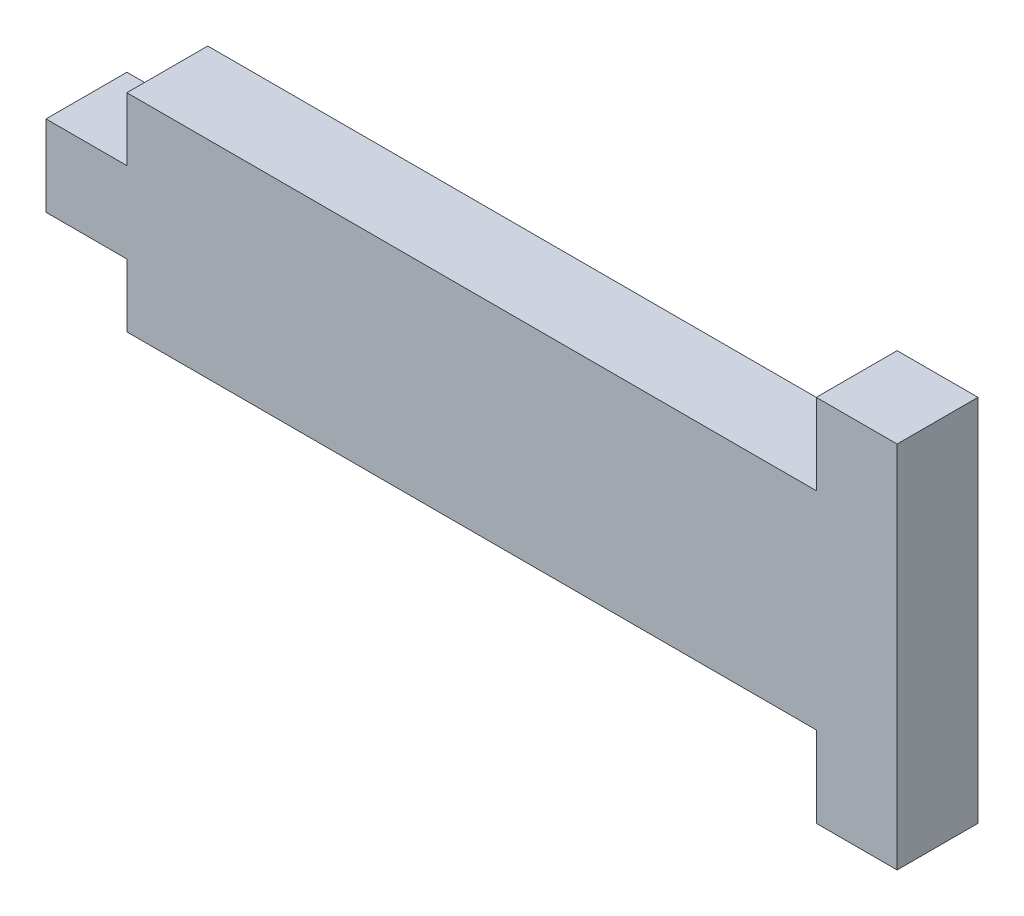
ISO-10303-21;
HEADER;
FILE_DESCRIPTION(('STEP AP214'),'2;1');
FILE_NAME('part.step','',(''),(''),'','','');
FILE_SCHEMA(('AUTOMOTIVE_DESIGN { 1 0 10303 214 1 1 1 1 }'));
ENDSEC;
DATA;
#1=APPLICATION_CONTEXT('core data for automotive mechanical design processes');
#2=APPLICATION_PROTOCOL_DEFINITION('international standard','automotive_design',2000,#1);
#3=PRODUCT_CONTEXT('',#1,'mechanical');
#4=PRODUCT('Part','Part','',(#3));
#5=PRODUCT_RELATED_PRODUCT_CATEGORY('part','',(#4));
#6=PRODUCT_DEFINITION_FORMATION('','',#4);
#7=PRODUCT_DEFINITION_CONTEXT('part definition',#1,'design');
#8=PRODUCT_DEFINITION('design','',#6,#7);
#9=PRODUCT_DEFINITION_SHAPE('','',#8);
#10=(LENGTH_UNIT() NAMED_UNIT(*) SI_UNIT(.MILLI.,.METRE.));
#11=(NAMED_UNIT(*) PLANE_ANGLE_UNIT() SI_UNIT($,.RADIAN.));
#12=(NAMED_UNIT(*) SI_UNIT($,.STERADIAN.) SOLID_ANGLE_UNIT());
#13=UNCERTAINTY_MEASURE_WITH_UNIT(LENGTH_MEASURE(1.E-05),#10,'distance_accuracy_value','');
#14=(GEOMETRIC_REPRESENTATION_CONTEXT(3) GLOBAL_UNCERTAINTY_ASSIGNED_CONTEXT((#13)) GLOBAL_UNIT_ASSIGNED_CONTEXT((#10,
#11,#12)) REPRESENTATION_CONTEXT('',''));
#15=CARTESIAN_POINT('',(0.,0.,0.));
#16=DIRECTION('',(0.,0.,1.));
#17=DIRECTION('',(1.,0.,0.));
#18=AXIS2_PLACEMENT_3D('',#15,#16,#17);
#19=CARTESIAN_POINT('',(-20.3,0.,4.7625));
#20=DIRECTION('',(1.,0.,0.));
#21=DIRECTION('',(0.,0.,-1.));
#22=AXIS2_PLACEMENT_3D('',#19,#20,#21);
#23=PLANE('',#22);
#24=DIRECTION('',(0.,-1.,0.));
#25=VECTOR('',#24,1.);
#26=CARTESIAN_POINT('',(-20.3,0.,0.));
#27=LINE('',#26,#25);
#28=CARTESIAN_POINT('',(-20.3,3.71875000000001,0.));
#29=VERTEX_POINT('',#28);
#30=CARTESIAN_POINT('',(-20.3,0.,0.));
#31=VERTEX_POINT('',#30);
#32=EDGE_CURVE('E159',#29,#31,#27,.T.);
#33=ORIENTED_EDGE('',*,*,#32,.T.);
#34=DIRECTION('',(0.,0.,-1.));
#35=VECTOR('',#34,1.);
#36=CARTESIAN_POINT('',(-20.3,0.,4.7625));
#37=LINE('',#36,#35);
#38=CARTESIAN_POINT('',(-20.3,0.,4.7625));
#39=VERTEX_POINT('',#38);
#40=EDGE_CURVE('E94',#39,#31,#37,.T.);
#41=ORIENTED_EDGE('',*,*,#40,.F.);
#42=DIRECTION('',(0.,-1.,0.));
#43=VECTOR('',#42,1.);
#44=CARTESIAN_POINT('',(-20.3,0.,4.7625));
#45=LINE('',#44,#43);
#46=CARTESIAN_POINT('',(-20.3,3.71875000000001,4.7625));
#47=VERTEX_POINT('',#46);
#48=EDGE_CURVE('E189',#47,#39,#45,.T.);
#49=ORIENTED_EDGE('',*,*,#48,.F.);
#50=DIRECTION('',(0.,0.,-1.));
#51=VECTOR('',#50,1.);
#52=CARTESIAN_POINT('',(-20.3,3.71875000000001,4.7625));
#53=LINE('',#52,#51);
#54=EDGE_CURVE('E13',#47,#29,#53,.T.);
#55=ORIENTED_EDGE('',*,*,#54,.T.);
#56=EDGE_LOOP('',(#33,#41,#49,#55));
#57=FACE_BOUND('',#56,.T.);
#58=ADVANCED_FACE('F84',(#57),#23,.F.);
#59=CARTESIAN_POINT('',(0.,0.,4.7625));
#60=DIRECTION('',(0.,1.,0.));
#61=DIRECTION('',(0.,0.,1.));
#62=AXIS2_PLACEMENT_3D('',#59,#60,#61);
#63=PLANE('',#62);
#64=DIRECTION('',(1.,0.,0.));
#65=VECTOR('',#64,1.);
#66=CARTESIAN_POINT('',(0.,0.,0.));
#67=LINE('',#66,#65);
#68=CARTESIAN_POINT('',(20.3,0.,1.8474805019153E-13));
#69=VERTEX_POINT('',#68);
#70=EDGE_CURVE('E231',#31,#69,#67,.T.);
#71=ORIENTED_EDGE('',*,*,#70,.T.);
#72=DIRECTION('',(0.,0.,-1.));
#73=VECTOR('',#72,1.);
#74=CARTESIAN_POINT('',(20.3,0.,4.76250000000018));
#75=LINE('',#74,#73);
#76=CARTESIAN_POINT('',(20.3,0.,4.76250000000018));
#77=VERTEX_POINT('',#76);
#78=EDGE_CURVE('E264',#77,#69,#75,.T.);
#79=ORIENTED_EDGE('',*,*,#78,.F.);
#80=DIRECTION('',(1.,0.,0.));
#81=VECTOR('',#80,1.);
#82=CARTESIAN_POINT('',(0.,0.,4.7625));
#83=LINE('',#82,#81);
#84=EDGE_CURVE('E193',#39,#77,#83,.T.);
#85=ORIENTED_EDGE('',*,*,#84,.F.);
#86=ORIENTED_EDGE('',*,*,#40,.T.);
#87=EDGE_LOOP('',(#71,#79,#85,#86));
#88=FACE_BOUND('',#87,.T.);
#89=ADVANCED_FACE('F290',(#88),#63,.F.);
#90=CARTESIAN_POINT('',(20.3,0.,4.76250000000031));
#91=DIRECTION('',(1.,0.,0.));
#92=DIRECTION('',(0.,1.,0.));
#93=AXIS2_PLACEMENT_3D('',#90,#91,#92);
#94=PLANE('',#93);
#95=DIRECTION('',(0.,-1.,0.));
#96=VECTOR('',#95,1.);
#97=CARTESIAN_POINT('',(20.3,0.,3.07046055247895E-13));
#98=LINE('',#97,#96);
#99=CARTESIAN_POINT('',(20.3,-4.76249999999999,3.07046055247895E-13));
#100=VERTEX_POINT('',#99);
#101=EDGE_CURVE('E233',#69,#100,#98,.T.);
#102=ORIENTED_EDGE('',*,*,#101,.T.);
#103=DIRECTION('',(0.,0.,-1.));
#104=VECTOR('',#103,1.);
#105=CARTESIAN_POINT('',(20.3,-4.76249999999999,4.76250000000031));
#106=LINE('',#105,#104);
#107=CARTESIAN_POINT('',(20.3,-4.76249999999999,4.76250000000031));
#108=VERTEX_POINT('',#107);
#109=EDGE_CURVE('E261',#108,#100,#106,.T.);
#110=ORIENTED_EDGE('',*,*,#109,.F.);
#111=DIRECTION('',(0.,-1.,0.));
#112=VECTOR('',#111,1.);
#113=CARTESIAN_POINT('',(20.3,0.,4.76250000000031));
#114=LINE('',#113,#112);
#115=EDGE_CURVE('E201',#77,#108,#114,.T.);
#116=ORIENTED_EDGE('',*,*,#115,.F.);
#117=ORIENTED_EDGE('',*,*,#78,.T.);
#118=EDGE_LOOP('',(#102,#110,#116,#117));
#119=FACE_BOUND('',#118,.T.);
#120=ADVANCED_FACE('F336',(#119),#94,.F.);
#121=CARTESIAN_POINT('',(0.,-4.7625,4.7625));
#122=DIRECTION('',(0.,1.,0.));
#123=DIRECTION('',(-1.,0.,0.));
#124=AXIS2_PLACEMENT_3D('',#121,#122,#123);
#125=PLANE('',#124);
#126=DIRECTION('',(1.,0.,0.));
#127=VECTOR('',#126,1.);
#128=CARTESIAN_POINT('',(0.,-4.7625,0.));
#129=LINE('',#128,#127);
#130=CARTESIAN_POINT('',(25.0625,-4.76249999999999,0.));
#131=VERTEX_POINT('',#130);
#132=EDGE_CURVE('E235',#100,#131,#129,.T.);
#133=ORIENTED_EDGE('',*,*,#132,.T.);
#134=DIRECTION('',(0.,0.,-1.));
#135=VECTOR('',#134,1.);
#136=CARTESIAN_POINT('',(25.0625,-4.76249999999999,4.7625));
#137=LINE('',#136,#135);
#138=CARTESIAN_POINT('',(25.0625,-4.76249999999999,4.7625));
#139=VERTEX_POINT('',#138);
#140=EDGE_CURVE('E258',#139,#131,#137,.T.);
#141=ORIENTED_EDGE('',*,*,#140,.F.);
#142=DIRECTION('',(1.,0.,0.));
#143=VECTOR('',#142,1.);
#144=CARTESIAN_POINT('',(0.,-4.7625,4.7625));
#145=LINE('',#144,#143);
#146=EDGE_CURVE('E206',#108,#139,#145,.T.);
#147=ORIENTED_EDGE('',*,*,#146,.F.);
#148=ORIENTED_EDGE('',*,*,#109,.T.);
#149=EDGE_LOOP('',(#133,#141,#147,#148));
#150=FACE_BOUND('',#149,.T.);
#151=ADVANCED_FACE('F339',(#150),#125,.F.);
#152=CARTESIAN_POINT('',(25.0625,0.,4.7625));
#153=DIRECTION('',(-1.,0.,0.));
#154=DIRECTION('',(0.,0.,1.));
#155=AXIS2_PLACEMENT_3D('',#152,#153,#154);
#156=PLANE('',#155);
#157=DIRECTION('',(0.,1.,0.));
#158=VECTOR('',#157,1.);
#159=CARTESIAN_POINT('',(25.0625,0.,0.));
#160=LINE('',#159,#158);
#161=CARTESIAN_POINT('',(25.0625,16.9625,0.));
#162=VERTEX_POINT('',#161);
#163=EDGE_CURVE('E237',#131,#162,#160,.T.);
#164=ORIENTED_EDGE('',*,*,#163,.T.);
#165=DIRECTION('',(0.,0.,-1.));
#166=VECTOR('',#165,1.);
#167=CARTESIAN_POINT('',(25.0625,16.9625,4.7625));
#168=LINE('',#167,#166);
#169=CARTESIAN_POINT('',(25.0625,16.9625,4.7625));
#170=VERTEX_POINT('',#169);
#171=EDGE_CURVE('E255',#170,#162,#168,.T.);
#172=ORIENTED_EDGE('',*,*,#171,.F.);
#173=DIRECTION('',(0.,1.,0.));
#174=VECTOR('',#173,1.);
#175=CARTESIAN_POINT('',(25.0625,0.,4.7625));
#176=LINE('',#175,#174);
#177=EDGE_CURVE('E213',#139,#170,#176,.T.);
#178=ORIENTED_EDGE('',*,*,#177,.F.);
#179=ORIENTED_EDGE('',*,*,#140,.T.);
#180=EDGE_LOOP('',(#164,#172,#178,#179));
#181=FACE_BOUND('',#180,.T.);
#182=ADVANCED_FACE('F343',(#181),#156,.F.);
#183=CARTESIAN_POINT('',(0.,16.9625,4.7625));
#184=DIRECTION('',(0.,-1.,0.));
#185=DIRECTION('',(1.,0.,0.));
#186=AXIS2_PLACEMENT_3D('',#183,#184,#185);
#187=PLANE('',#186);
#188=DIRECTION('',(-1.,0.,0.));
#189=VECTOR('',#188,1.);
#190=CARTESIAN_POINT('',(0.,16.9625,0.));
#191=LINE('',#190,#189);
#192=CARTESIAN_POINT('',(20.3,16.9625,1.07552855510562E-13));
#193=VERTEX_POINT('',#192);
#194=EDGE_CURVE('E239',#162,#193,#191,.T.);
#195=ORIENTED_EDGE('',*,*,#194,.T.);
#196=DIRECTION('',(0.,0.,-1.));
#197=VECTOR('',#196,1.);
#198=CARTESIAN_POINT('',(20.3,16.9625,4.76250000000011));
#199=LINE('',#198,#197);
#200=CARTESIAN_POINT('',(20.3,16.9625,4.76250000000011));
#201=VERTEX_POINT('',#200);
#202=EDGE_CURVE('E252',#201,#193,#199,.T.);
#203=ORIENTED_EDGE('',*,*,#202,.F.);
#204=DIRECTION('',(-1.,0.,0.));
#205=VECTOR('',#204,1.);
#206=CARTESIAN_POINT('',(0.,16.9625,4.7625));
#207=LINE('',#206,#205);
#208=EDGE_CURVE('E217',#170,#201,#207,.T.);
#209=ORIENTED_EDGE('',*,*,#208,.F.);
#210=ORIENTED_EDGE('',*,*,#171,.T.);
#211=EDGE_LOOP('',(#195,#203,#209,#210));
#212=FACE_BOUND('',#211,.T.);
#213=ADVANCED_FACE('F347',(#212),#187,.F.);
#214=CARTESIAN_POINT('',(20.3,0.,4.76250000000011));
#215=DIRECTION('',(1.,0.,0.));
#216=DIRECTION('',(0.,1.,0.));
#217=AXIS2_PLACEMENT_3D('',#214,#215,#216);
#218=PLANE('',#217);
#219=DIRECTION('',(0.,-1.,0.));
#220=VECTOR('',#219,1.);
#221=CARTESIAN_POINT('',(20.3,0.,1.07552855510562E-13));
#222=LINE('',#221,#220);
#223=CARTESIAN_POINT('',(20.3,12.1999999999999,0.));
#224=VERTEX_POINT('',#223);
#225=EDGE_CURVE('E241',#193,#224,#222,.T.);
#226=ORIENTED_EDGE('',*,*,#225,.T.);
#227=DIRECTION('',(0.,0.,-1.));
#228=VECTOR('',#227,1.);
#229=CARTESIAN_POINT('',(20.3,12.1999999999999,4.76250000000009));
#230=LINE('',#229,#228);
#231=CARTESIAN_POINT('',(20.3,12.1999999999999,4.76250000000009));
#232=VERTEX_POINT('',#231);
#233=EDGE_CURVE('E249',#232,#224,#230,.T.);
#234=ORIENTED_EDGE('',*,*,#233,.F.);
#235=DIRECTION('',(0.,-1.,0.));
#236=VECTOR('',#235,1.);
#237=CARTESIAN_POINT('',(20.3,0.,4.76250000000011));
#238=LINE('',#237,#236);
#239=EDGE_CURVE('E222',#201,#232,#238,.T.);
#240=ORIENTED_EDGE('',*,*,#239,.F.);
#241=ORIENTED_EDGE('',*,*,#202,.T.);
#242=EDGE_LOOP('',(#226,#234,#240,#241));
#243=FACE_BOUND('',#242,.T.);
#244=ADVANCED_FACE('F310',(#243),#218,.F.);
#245=CARTESIAN_POINT('',(0.,12.2,4.7625));
#246=DIRECTION('',(0.,-1.,0.));
#247=DIRECTION('',(0.,0.,-1.));
#248=AXIS2_PLACEMENT_3D('',#245,#246,#247);
#249=PLANE('',#248);
#250=DIRECTION('',(-1.,0.,0.));
#251=VECTOR('',#250,1.);
#252=CARTESIAN_POINT('',(0.,12.2,0.));
#253=LINE('',#252,#251);
#254=CARTESIAN_POINT('',(-20.3,12.2,0.));
#255=VERTEX_POINT('',#254);
#256=EDGE_CURVE('E243',#224,#255,#253,.T.);
#257=ORIENTED_EDGE('',*,*,#256,.T.);
#258=DIRECTION('',(0.,0.,-1.));
#259=VECTOR('',#258,1.);
#260=CARTESIAN_POINT('',(-20.3,12.2,4.7625));
#261=LINE('',#260,#259);
#262=CARTESIAN_POINT('',(-20.3,12.2,4.7625));
#263=VERTEX_POINT('',#262);
#264=EDGE_CURVE('E246',#263,#255,#261,.T.);
#265=ORIENTED_EDGE('',*,*,#264,.F.);
#266=DIRECTION('',(-1.,0.,0.));
#267=VECTOR('',#266,1.);
#268=CARTESIAN_POINT('',(0.,12.2,4.7625));
#269=LINE('',#268,#267);
#270=EDGE_CURVE('E226',#232,#263,#269,.T.);
#271=ORIENTED_EDGE('',*,*,#270,.F.);
#272=ORIENTED_EDGE('',*,*,#233,.T.);
#273=EDGE_LOOP('',(#257,#265,#271,#272));
#274=FACE_BOUND('',#273,.T.);
#275=ADVANCED_FACE('F314',(#274),#249,.F.);
#276=CARTESIAN_POINT('',(-20.3,8.48125000000001,0.));
#277=VERTEX_POINT('',#276);
#278=EDGE_CURVE('E194',#255,#277,#27,.T.);
#279=ORIENTED_EDGE('',*,*,#278,.T.);
#280=DIRECTION('',(0.,0.,-1.));
#281=VECTOR('',#280,1.);
#282=CARTESIAN_POINT('',(-20.3,8.48125000000001,4.7625));
#283=LINE('',#282,#281);
#284=CARTESIAN_POINT('',(-20.3,8.48125000000001,4.7625));
#285=VERTEX_POINT('',#284);
#286=EDGE_CURVE('E103',#285,#277,#283,.T.);
#287=ORIENTED_EDGE('',*,*,#286,.F.);
#288=EDGE_CURVE('E195',#263,#285,#45,.T.);
#289=ORIENTED_EDGE('',*,*,#288,.F.);
#290=ORIENTED_EDGE('',*,*,#264,.T.);
#291=EDGE_LOOP('',(#279,#287,#289,#290));
#292=FACE_BOUND('',#291,.T.);
#293=ADVANCED_FACE('F315',(#292),#23,.F.);
#294=CARTESIAN_POINT('',(0.,0.,0.));
#295=DIRECTION('',(0.,0.,1.));
#296=DIRECTION('',(1.,0.,0.));
#297=AXIS2_PLACEMENT_3D('',#294,#295,#296);
#298=PLANE('',#297);
#299=DIRECTION('',(1.,0.,0.));
#300=VECTOR('',#299,1.);
#301=CARTESIAN_POINT('',(-25.0625,8.48125,0.));
#302=LINE('',#301,#300);
#303=CARTESIAN_POINT('',(-25.0625,8.48125,0.));
#304=VERTEX_POINT('',#303);
#305=EDGE_CURVE('E165',#304,#277,#302,.T.);
#306=ORIENTED_EDGE('',*,*,#305,.T.);
#307=ORIENTED_EDGE('',*,*,#278,.F.);
#308=ORIENTED_EDGE('',*,*,#256,.F.);
#309=ORIENTED_EDGE('',*,*,#225,.F.);
#310=ORIENTED_EDGE('',*,*,#194,.F.);
#311=ORIENTED_EDGE('',*,*,#163,.F.);
#312=ORIENTED_EDGE('',*,*,#132,.F.);
#313=ORIENTED_EDGE('',*,*,#101,.F.);
#314=ORIENTED_EDGE('',*,*,#70,.F.);
#315=ORIENTED_EDGE('',*,*,#32,.F.);
#316=DIRECTION('',(1.,0.,0.));
#317=VECTOR('',#316,1.);
#318=CARTESIAN_POINT('',(-25.0625,3.71875,0.));
#319=LINE('',#318,#317);
#320=CARTESIAN_POINT('',(-25.0625,3.71875,0.));
#321=VERTEX_POINT('',#320);
#322=EDGE_CURVE('E168',#321,#29,#319,.T.);
#323=ORIENTED_EDGE('',*,*,#322,.F.);
#324=DIRECTION('',(0.,-1.,0.));
#325=VECTOR('',#324,1.);
#326=CARTESIAN_POINT('',(-25.0625,8.48125,0.));
#327=LINE('',#326,#325);
#328=EDGE_CURVE('E150',#304,#321,#327,.T.);
#329=ORIENTED_EDGE('',*,*,#328,.F.);
#330=EDGE_LOOP('',(#306,#307,#308,#309,#310,#311,#312,#313,#314,#315,#323,#329));
#331=FACE_BOUND('',#330,.T.);
#332=ADVANCED_FACE('F163',(#331),#298,.F.);
#333=CARTESIAN_POINT('',(0.,0.,4.7625));
#334=DIRECTION('',(0.,0.,1.));
#335=DIRECTION('',(1.,0.,0.));
#336=AXIS2_PLACEMENT_3D('',#333,#334,#335);
#337=PLANE('',#336);
#338=ORIENTED_EDGE('',*,*,#288,.T.);
#339=DIRECTION('',(1.,0.,0.));
#340=VECTOR('',#339,1.);
#341=CARTESIAN_POINT('',(-25.0625,8.48125,4.7625));
#342=LINE('',#341,#340);
#343=CARTESIAN_POINT('',(-25.0625,8.48125,4.7625));
#344=VERTEX_POINT('',#343);
#345=EDGE_CURVE('E169',#344,#285,#342,.T.);
#346=ORIENTED_EDGE('',*,*,#345,.F.);
#347=DIRECTION('',(0.,-1.,0.));
#348=VECTOR('',#347,1.);
#349=CARTESIAN_POINT('',(-25.0625,8.48125,4.7625));
#350=LINE('',#349,#348);
#351=CARTESIAN_POINT('',(-25.0625,3.71875,4.7625));
#352=VERTEX_POINT('',#351);
#353=EDGE_CURVE('E155',#344,#352,#350,.T.);
#354=ORIENTED_EDGE('',*,*,#353,.T.);
#355=DIRECTION('',(1.,0.,0.));
#356=VECTOR('',#355,1.);
#357=CARTESIAN_POINT('',(-25.0625,3.71875,4.7625));
#358=LINE('',#357,#356);
#359=EDGE_CURVE('E177',#352,#47,#358,.T.);
#360=ORIENTED_EDGE('',*,*,#359,.T.);
#361=ORIENTED_EDGE('',*,*,#48,.T.);
#362=ORIENTED_EDGE('',*,*,#84,.T.);
#363=ORIENTED_EDGE('',*,*,#115,.T.);
#364=ORIENTED_EDGE('',*,*,#146,.T.);
#365=ORIENTED_EDGE('',*,*,#177,.T.);
#366=ORIENTED_EDGE('',*,*,#208,.T.);
#367=ORIENTED_EDGE('',*,*,#239,.T.);
#368=ORIENTED_EDGE('',*,*,#270,.T.);
#369=EDGE_LOOP('',(#338,#346,#354,#360,#361,#362,#363,#364,#365,#366,#367,#368));
#370=FACE_BOUND('',#369,.T.);
#371=ADVANCED_FACE('F277',(#370),#337,.T.);
#372=CARTESIAN_POINT('',(-25.0625,8.48125,4.7625));
#373=DIRECTION('',(1.,0.,0.));
#374=DIRECTION('',(0.,0.,-1.));
#375=AXIS2_PLACEMENT_3D('',#372,#373,#374);
#376=PLANE('',#375);
#377=ORIENTED_EDGE('',*,*,#328,.T.);
#378=DIRECTION('',(0.,0.,-1.));
#379=VECTOR('',#378,1.);
#380=CARTESIAN_POINT('',(-25.0625,3.71875,4.7625));
#381=LINE('',#380,#379);
#382=EDGE_CURVE('E88',#352,#321,#381,.T.);
#383=ORIENTED_EDGE('',*,*,#382,.F.);
#384=ORIENTED_EDGE('',*,*,#353,.F.);
#385=DIRECTION('',(0.,0.,-1.));
#386=VECTOR('',#385,1.);
#387=CARTESIAN_POINT('',(-25.0625,8.48125,4.7625));
#388=LINE('',#387,#386);
#389=EDGE_CURVE('E153',#344,#304,#388,.T.);
#390=ORIENTED_EDGE('',*,*,#389,.T.);
#391=EDGE_LOOP('',(#377,#383,#384,#390));
#392=FACE_BOUND('',#391,.T.);
#393=ADVANCED_FACE('F154',(#392),#376,.F.);
#394=CARTESIAN_POINT('',(-25.0625,3.71875,4.7625));
#395=DIRECTION('',(0.,1.,0.));
#396=DIRECTION('',(0.,0.,1.));
#397=AXIS2_PLACEMENT_3D('',#394,#395,#396);
#398=PLANE('',#397);
#399=ORIENTED_EDGE('',*,*,#322,.T.);
#400=ORIENTED_EDGE('',*,*,#54,.F.);
#401=ORIENTED_EDGE('',*,*,#359,.F.);
#402=ORIENTED_EDGE('',*,*,#382,.T.);
#403=EDGE_LOOP('',(#399,#400,#401,#402));
#404=FACE_BOUND('',#403,.T.);
#405=ADVANCED_FACE('F326',(#404),#398,.F.);
#406=CARTESIAN_POINT('',(-25.0625,8.48125,4.7625));
#407=DIRECTION('',(0.,1.,0.));
#408=DIRECTION('',(0.,0.,1.));
#409=AXIS2_PLACEMENT_3D('',#406,#407,#408);
#410=PLANE('',#409);
#411=ORIENTED_EDGE('',*,*,#286,.T.);
#412=ORIENTED_EDGE('',*,*,#305,.F.);
#413=ORIENTED_EDGE('',*,*,#389,.F.);
#414=ORIENTED_EDGE('',*,*,#345,.T.);
#415=EDGE_LOOP('',(#411,#412,#413,#414));
#416=FACE_BOUND('',#415,.T.);
#417=ADVANCED_FACE('F86',(#416),#410,.T.);
#418=CLOSED_SHELL('',(#58,#89,#120,#151,#182,#213,#244,#275,#293,#332,#371,#393,#405,#417));
#419=MANIFOLD_SOLID_BREP('B2',#418);
#420=ADVANCED_BREP_SHAPE_REPRESENTATION('',(#18,#419),#14);
#421=SHAPE_DEFINITION_REPRESENTATION(#9,#420);
ENDSEC;
END-ISO-10303-21;
